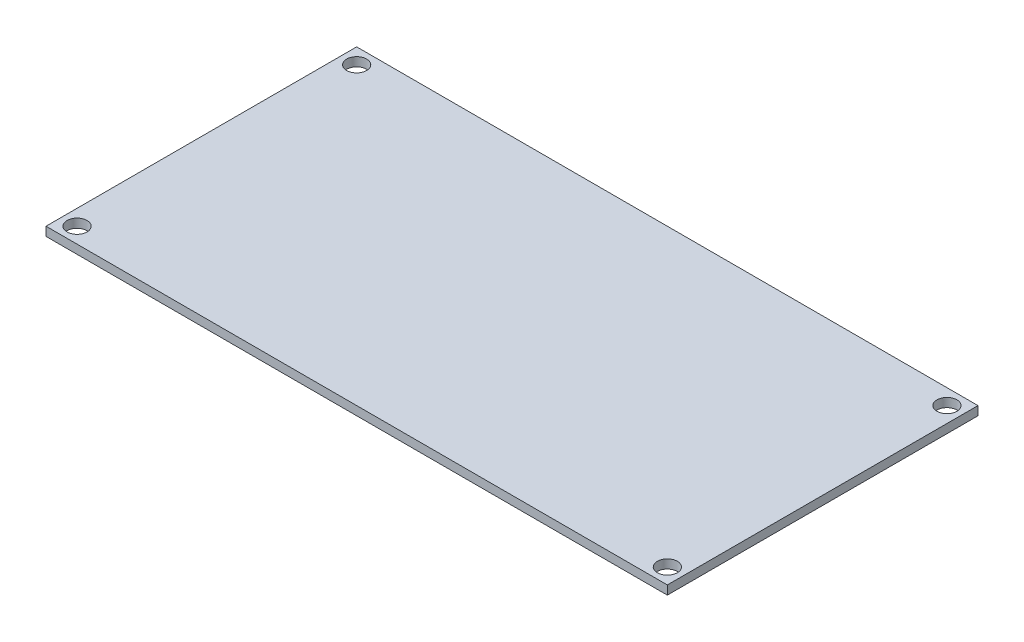
ISO-10303-21;
HEADER;
FILE_DESCRIPTION(('STEP AP214'),'2;1');
FILE_NAME('part.step','',(''),(''),'','','');
FILE_SCHEMA(('AUTOMOTIVE_DESIGN { 1 0 10303 214 1 1 1 1 }'));
ENDSEC;
DATA;
#1=APPLICATION_CONTEXT('core data for automotive mechanical design processes');
#2=APPLICATION_PROTOCOL_DEFINITION('international standard','automotive_design',2000,#1);
#3=PRODUCT_CONTEXT('',#1,'mechanical');
#4=PRODUCT('Part','Part','',(#3));
#5=PRODUCT_RELATED_PRODUCT_CATEGORY('part','',(#4));
#6=PRODUCT_DEFINITION_FORMATION('','',#4);
#7=PRODUCT_DEFINITION_CONTEXT('part definition',#1,'design');
#8=PRODUCT_DEFINITION('design','',#6,#7);
#9=PRODUCT_DEFINITION_SHAPE('','',#8);
#10=(LENGTH_UNIT() NAMED_UNIT(*) SI_UNIT(.MILLI.,.METRE.));
#11=(NAMED_UNIT(*) PLANE_ANGLE_UNIT() SI_UNIT($,.RADIAN.));
#12=(NAMED_UNIT(*) SI_UNIT($,.STERADIAN.) SOLID_ANGLE_UNIT());
#13=UNCERTAINTY_MEASURE_WITH_UNIT(LENGTH_MEASURE(1.E-05),#10,'distance_accuracy_value','');
#14=(GEOMETRIC_REPRESENTATION_CONTEXT(3) GLOBAL_UNCERTAINTY_ASSIGNED_CONTEXT((#13)) GLOBAL_UNIT_ASSIGNED_CONTEXT((#10,
#11,#12)) REPRESENTATION_CONTEXT('',''));
#15=CARTESIAN_POINT('',(0.,0.,0.));
#16=DIRECTION('',(0.,0.,1.));
#17=DIRECTION('',(1.,0.,0.));
#18=AXIS2_PLACEMENT_3D('',#15,#16,#17);
#19=CARTESIAN_POINT('',(50.8,1.4478,25.4));
#20=DIRECTION('',(-1.,0.,0.));
#21=DIRECTION('',(0.,0.,1.));
#22=AXIS2_PLACEMENT_3D('',#19,#20,#21);
#23=PLANE('',#22);
#24=DIRECTION('',(0.,0.,-1.));
#25=VECTOR('',#24,1.);
#26=CARTESIAN_POINT('',(50.8,0.,25.4));
#27=LINE('',#26,#25);
#28=CARTESIAN_POINT('',(50.8,0.,25.4));
#29=VERTEX_POINT('',#28);
#30=CARTESIAN_POINT('',(50.8,0.,-25.4));
#31=VERTEX_POINT('',#30);
#32=EDGE_CURVE('E98',#29,#31,#27,.T.);
#33=ORIENTED_EDGE('',*,*,#32,.T.);
#34=DIRECTION('',(0.,-1.,0.));
#35=VECTOR('',#34,1.);
#36=CARTESIAN_POINT('',(50.8,1.4478,-25.4));
#37=LINE('',#36,#35);
#38=CARTESIAN_POINT('',(50.8,1.4478,-25.4));
#39=VERTEX_POINT('',#38);
#40=EDGE_CURVE('E11',#39,#31,#37,.T.);
#41=ORIENTED_EDGE('',*,*,#40,.F.);
#42=DIRECTION('',(0.,0.,-1.));
#43=VECTOR('',#42,1.);
#44=CARTESIAN_POINT('',(50.8,1.4478,25.4));
#45=LINE('',#44,#43);
#46=CARTESIAN_POINT('',(50.8,1.4478,25.4));
#47=VERTEX_POINT('',#46);
#48=EDGE_CURVE('E86',#47,#39,#45,.T.);
#49=ORIENTED_EDGE('',*,*,#48,.F.);
#50=DIRECTION('',(0.,-1.,0.));
#51=VECTOR('',#50,1.);
#52=CARTESIAN_POINT('',(50.8,1.4478,25.4));
#53=LINE('',#52,#51);
#54=EDGE_CURVE('E94',#47,#29,#53,.T.);
#55=ORIENTED_EDGE('',*,*,#54,.T.);
#56=EDGE_LOOP('',(#33,#41,#49,#55));
#57=FACE_BOUND('',#56,.T.);
#58=ADVANCED_FACE('F35',(#57),#23,.F.);
#59=CARTESIAN_POINT('',(-50.8,1.4478,-25.4));
#60=DIRECTION('',(0.,0.,1.));
#61=DIRECTION('',(1.,0.,0.));
#62=AXIS2_PLACEMENT_3D('',#59,#60,#61);
#63=PLANE('',#62);
#64=DIRECTION('',(-1.,0.,0.));
#65=VECTOR('',#64,1.);
#66=CARTESIAN_POINT('',(-50.8,0.,-25.4));
#67=LINE('',#66,#65);
#68=CARTESIAN_POINT('',(-50.8,0.,-25.4));
#69=VERTEX_POINT('',#68);
#70=EDGE_CURVE('E90',#31,#69,#67,.T.);
#71=ORIENTED_EDGE('',*,*,#70,.T.);
#72=DIRECTION('',(0.,-1.,0.));
#73=VECTOR('',#72,1.);
#74=CARTESIAN_POINT('',(-50.8,1.4478,-25.4));
#75=LINE('',#74,#73);
#76=CARTESIAN_POINT('',(-50.8,1.4478,-25.4));
#77=VERTEX_POINT('',#76);
#78=EDGE_CURVE('E43',#77,#69,#75,.T.);
#79=ORIENTED_EDGE('',*,*,#78,.F.);
#80=DIRECTION('',(-1.,0.,0.));
#81=VECTOR('',#80,1.);
#82=CARTESIAN_POINT('',(-50.8,1.4478,-25.4));
#83=LINE('',#82,#81);
#84=EDGE_CURVE('E81',#39,#77,#83,.T.);
#85=ORIENTED_EDGE('',*,*,#84,.F.);
#86=ORIENTED_EDGE('',*,*,#40,.T.);
#87=EDGE_LOOP('',(#71,#79,#85,#86));
#88=FACE_BOUND('',#87,.T.);
#89=ADVANCED_FACE('F89',(#88),#63,.F.);
#90=CARTESIAN_POINT('',(-50.8,1.4478,25.4));
#91=DIRECTION('',(1.,0.,0.));
#92=DIRECTION('',(0.,0.,-1.));
#93=AXIS2_PLACEMENT_3D('',#90,#91,#92);
#94=PLANE('',#93);
#95=DIRECTION('',(0.,0.,1.));
#96=VECTOR('',#95,1.);
#97=CARTESIAN_POINT('',(-50.8,0.,25.4));
#98=LINE('',#97,#96);
#99=CARTESIAN_POINT('',(-50.8,0.,25.4));
#100=VERTEX_POINT('',#99);
#101=EDGE_CURVE('E68',#69,#100,#98,.T.);
#102=ORIENTED_EDGE('',*,*,#101,.T.);
#103=DIRECTION('',(0.,-1.,0.));
#104=VECTOR('',#103,1.);
#105=CARTESIAN_POINT('',(-50.8,1.4478,25.4));
#106=LINE('',#105,#104);
#107=CARTESIAN_POINT('',(-50.8,1.4478,25.4));
#108=VERTEX_POINT('',#107);
#109=EDGE_CURVE('E91',#108,#100,#106,.T.);
#110=ORIENTED_EDGE('',*,*,#109,.F.);
#111=DIRECTION('',(0.,0.,1.));
#112=VECTOR('',#111,1.);
#113=CARTESIAN_POINT('',(-50.8,1.4478,25.4));
#114=LINE('',#113,#112);
#115=EDGE_CURVE('E84',#77,#108,#114,.T.);
#116=ORIENTED_EDGE('',*,*,#115,.F.);
#117=ORIENTED_EDGE('',*,*,#78,.T.);
#118=EDGE_LOOP('',(#102,#110,#116,#117));
#119=FACE_BOUND('',#118,.T.);
#120=ADVANCED_FACE('F92',(#119),#94,.F.);
#121=CARTESIAN_POINT('',(-50.8,1.4478,25.4));
#122=DIRECTION('',(0.,0.,-1.));
#123=DIRECTION('',(-1.,0.,0.));
#124=AXIS2_PLACEMENT_3D('',#121,#122,#123);
#125=PLANE('',#124);
#126=DIRECTION('',(1.,0.,0.));
#127=VECTOR('',#126,1.);
#128=CARTESIAN_POINT('',(-50.8,0.,25.4));
#129=LINE('',#128,#127);
#130=EDGE_CURVE('E74',#100,#29,#129,.T.);
#131=ORIENTED_EDGE('',*,*,#130,.T.);
#132=ORIENTED_EDGE('',*,*,#54,.F.);
#133=DIRECTION('',(1.,0.,0.));
#134=VECTOR('',#133,1.);
#135=CARTESIAN_POINT('',(-50.8,1.4478,25.4));
#136=LINE('',#135,#134);
#137=EDGE_CURVE('E51',#108,#47,#136,.T.);
#138=ORIENTED_EDGE('',*,*,#137,.F.);
#139=ORIENTED_EDGE('',*,*,#109,.T.);
#140=EDGE_LOOP('',(#131,#132,#138,#139));
#141=FACE_BOUND('',#140,.T.);
#142=ADVANCED_FACE('F106',(#141),#125,.F.);
#143=CARTESIAN_POINT('',(0.,1.4478,0.));
#144=DIRECTION('',(0.,-1.,0.));
#145=DIRECTION('',(0.,0.,-1.));
#146=AXIS2_PLACEMENT_3D('',#143,#144,#145);
#147=PLANE('',#146);
#148=CARTESIAN_POINT('',(-48.26,1.4478,22.86));
#149=DIRECTION('',(0.,1.,0.));
#150=DIRECTION('',(0.,0.,1.));
#151=AXIS2_PLACEMENT_3D('',#148,#149,#150);
#152=CIRCLE('',#151,1.63195);
#153=CARTESIAN_POINT('',(-48.26,1.4478,24.49195));
#154=VERTEX_POINT('',#153);
#155=EDGE_CURVE('E130',#154,#154,#152,.T.);
#156=ORIENTED_EDGE('',*,*,#155,.F.);
#157=EDGE_LOOP('',(#156));
#158=FACE_BOUND('',#157,.T.);
#159=CARTESIAN_POINT('',(48.26,1.4478,22.86));
#160=DIRECTION('',(0.,1.,0.));
#161=DIRECTION('',(0.,0.,1.));
#162=AXIS2_PLACEMENT_3D('',#159,#160,#161);
#163=CIRCLE('',#162,1.63195);
#164=CARTESIAN_POINT('',(48.26,1.4478,24.49195));
#165=VERTEX_POINT('',#164);
#166=EDGE_CURVE('E124',#165,#165,#163,.T.);
#167=ORIENTED_EDGE('',*,*,#166,.F.);
#168=EDGE_LOOP('',(#167));
#169=FACE_BOUND('',#168,.T.);
#170=CARTESIAN_POINT('',(48.26,1.4478,-22.86));
#171=DIRECTION('',(0.,1.,0.));
#172=DIRECTION('',(0.,0.,1.));
#173=AXIS2_PLACEMENT_3D('',#170,#171,#172);
#174=CIRCLE('',#173,1.63195);
#175=CARTESIAN_POINT('',(48.26,1.4478,-21.22805));
#176=VERTEX_POINT('',#175);
#177=EDGE_CURVE('E118',#176,#176,#174,.T.);
#178=ORIENTED_EDGE('',*,*,#177,.F.);
#179=EDGE_LOOP('',(#178));
#180=FACE_BOUND('',#179,.T.);
#181=CARTESIAN_POINT('',(-48.26,1.4478,-22.86));
#182=DIRECTION('',(0.,1.,0.));
#183=DIRECTION('',(0.,0.,1.));
#184=AXIS2_PLACEMENT_3D('',#181,#182,#183);
#185=CIRCLE('',#184,1.63195);
#186=CARTESIAN_POINT('',(-48.26,1.4478,-21.22805));
#187=VERTEX_POINT('',#186);
#188=EDGE_CURVE('E112',#187,#187,#185,.T.);
#189=ORIENTED_EDGE('',*,*,#188,.F.);
#190=EDGE_LOOP('',(#189));
#191=FACE_BOUND('',#190,.T.);
#192=ORIENTED_EDGE('',*,*,#48,.T.);
#193=ORIENTED_EDGE('',*,*,#84,.T.);
#194=ORIENTED_EDGE('',*,*,#115,.T.);
#195=ORIENTED_EDGE('',*,*,#137,.T.);
#196=EDGE_LOOP('',(#192,#193,#194,#195));
#197=FACE_BOUND('',#196,.T.);
#198=ADVANCED_FACE('F82',(#158,#169,#180,#191,#197),#147,.F.);
#199=CARTESIAN_POINT('',(0.,0.,0.));
#200=DIRECTION('',(0.,-1.,0.));
#201=DIRECTION('',(0.,0.,-1.));
#202=AXIS2_PLACEMENT_3D('',#199,#200,#201);
#203=PLANE('',#202);
#204=CARTESIAN_POINT('',(-48.26,0.,22.86));
#205=DIRECTION('',(0.,1.,0.));
#206=DIRECTION('',(0.,0.,1.));
#207=AXIS2_PLACEMENT_3D('',#204,#205,#206);
#208=CIRCLE('',#207,1.63195);
#209=CARTESIAN_POINT('',(-48.26,0.,24.49195));
#210=VERTEX_POINT('',#209);
#211=EDGE_CURVE('E115',#210,#210,#208,.T.);
#212=ORIENTED_EDGE('',*,*,#211,.T.);
#213=EDGE_LOOP('',(#212));
#214=FACE_BOUND('',#213,.T.);
#215=CARTESIAN_POINT('',(48.26,0.,22.86));
#216=DIRECTION('',(0.,1.,0.));
#217=DIRECTION('',(0.,0.,1.));
#218=AXIS2_PLACEMENT_3D('',#215,#216,#217);
#219=CIRCLE('',#218,1.63195);
#220=CARTESIAN_POINT('',(48.26,0.,24.49195));
#221=VERTEX_POINT('',#220);
#222=EDGE_CURVE('E127',#221,#221,#219,.T.);
#223=ORIENTED_EDGE('',*,*,#222,.T.);
#224=EDGE_LOOP('',(#223));
#225=FACE_BOUND('',#224,.T.);
#226=CARTESIAN_POINT('',(48.26,0.,-22.86));
#227=DIRECTION('',(0.,1.,0.));
#228=DIRECTION('',(0.,0.,1.));
#229=AXIS2_PLACEMENT_3D('',#226,#227,#228);
#230=CIRCLE('',#229,1.63195);
#231=CARTESIAN_POINT('',(48.26,0.,-21.22805));
#232=VERTEX_POINT('',#231);
#233=EDGE_CURVE('E121',#232,#232,#230,.T.);
#234=ORIENTED_EDGE('',*,*,#233,.T.);
#235=EDGE_LOOP('',(#234));
#236=FACE_BOUND('',#235,.T.);
#237=CARTESIAN_POINT('',(-48.26,0.,-22.86));
#238=DIRECTION('',(0.,1.,0.));
#239=DIRECTION('',(0.,0.,1.));
#240=AXIS2_PLACEMENT_3D('',#237,#238,#239);
#241=CIRCLE('',#240,1.63195);
#242=CARTESIAN_POINT('',(-48.26,0.,-21.22805));
#243=VERTEX_POINT('',#242);
#244=EDGE_CURVE('E101',#243,#243,#241,.T.);
#245=ORIENTED_EDGE('',*,*,#244,.T.);
#246=EDGE_LOOP('',(#245));
#247=FACE_BOUND('',#246,.T.);
#248=ORIENTED_EDGE('',*,*,#32,.F.);
#249=ORIENTED_EDGE('',*,*,#130,.F.);
#250=ORIENTED_EDGE('',*,*,#101,.F.);
#251=ORIENTED_EDGE('',*,*,#70,.F.);
#252=EDGE_LOOP('',(#248,#249,#250,#251));
#253=FACE_BOUND('',#252,.T.);
#254=ADVANCED_FACE('F109',(#214,#225,#236,#247,#253),#203,.T.);
#255=CARTESIAN_POINT('',(-48.26,0.,-22.86));
#256=DIRECTION('',(0.,1.,0.));
#257=DIRECTION('',(0.,0.,1.));
#258=AXIS2_PLACEMENT_3D('',#255,#256,#257);
#259=CYLINDRICAL_SURFACE('',#258,1.63195);
#260=ORIENTED_EDGE('',*,*,#244,.F.);
#261=EDGE_LOOP('',(#260));
#262=FACE_BOUND('',#261,.T.);
#263=ORIENTED_EDGE('',*,*,#188,.T.);
#264=EDGE_LOOP('',(#263));
#265=FACE_BOUND('',#264,.T.);
#266=ADVANCED_FACE('F154',(#262,#265),#259,.F.);
#267=CARTESIAN_POINT('',(48.26,0.,-22.86));
#268=DIRECTION('',(0.,1.,0.));
#269=DIRECTION('',(0.,0.,1.));
#270=AXIS2_PLACEMENT_3D('',#267,#268,#269);
#271=CYLINDRICAL_SURFACE('',#270,1.63195);
#272=ORIENTED_EDGE('',*,*,#233,.F.);
#273=EDGE_LOOP('',(#272));
#274=FACE_BOUND('',#273,.T.);
#275=ORIENTED_EDGE('',*,*,#177,.T.);
#276=EDGE_LOOP('',(#275));
#277=FACE_BOUND('',#276,.T.);
#278=ADVANCED_FACE('F156',(#274,#277),#271,.F.);
#279=CARTESIAN_POINT('',(48.26,0.,22.86));
#280=DIRECTION('',(0.,1.,0.));
#281=DIRECTION('',(0.,0.,1.));
#282=AXIS2_PLACEMENT_3D('',#279,#280,#281);
#283=CYLINDRICAL_SURFACE('',#282,1.63195);
#284=ORIENTED_EDGE('',*,*,#222,.F.);
#285=EDGE_LOOP('',(#284));
#286=FACE_BOUND('',#285,.T.);
#287=ORIENTED_EDGE('',*,*,#166,.T.);
#288=EDGE_LOOP('',(#287));
#289=FACE_BOUND('',#288,.T.);
#290=ADVANCED_FACE('F141',(#286,#289),#283,.F.);
#291=CARTESIAN_POINT('',(-48.26,0.,22.86));
#292=DIRECTION('',(0.,1.,0.));
#293=DIRECTION('',(0.,0.,1.));
#294=AXIS2_PLACEMENT_3D('',#291,#292,#293);
#295=CYLINDRICAL_SURFACE('',#294,1.63195);
#296=ORIENTED_EDGE('',*,*,#211,.F.);
#297=EDGE_LOOP('',(#296));
#298=FACE_BOUND('',#297,.T.);
#299=ORIENTED_EDGE('',*,*,#155,.T.);
#300=EDGE_LOOP('',(#299));
#301=FACE_BOUND('',#300,.T.);
#302=ADVANCED_FACE('F138',(#298,#301),#295,.F.);
#303=CLOSED_SHELL('',(#58,#89,#120,#142,#198,#254,#266,#278,#290,#302));
#304=MANIFOLD_SOLID_BREP('B2',#303);
#305=ADVANCED_BREP_SHAPE_REPRESENTATION('',(#18,#304),#14);
#306=SHAPE_DEFINITION_REPRESENTATION(#9,#305);
ENDSEC;
END-ISO-10303-21;
